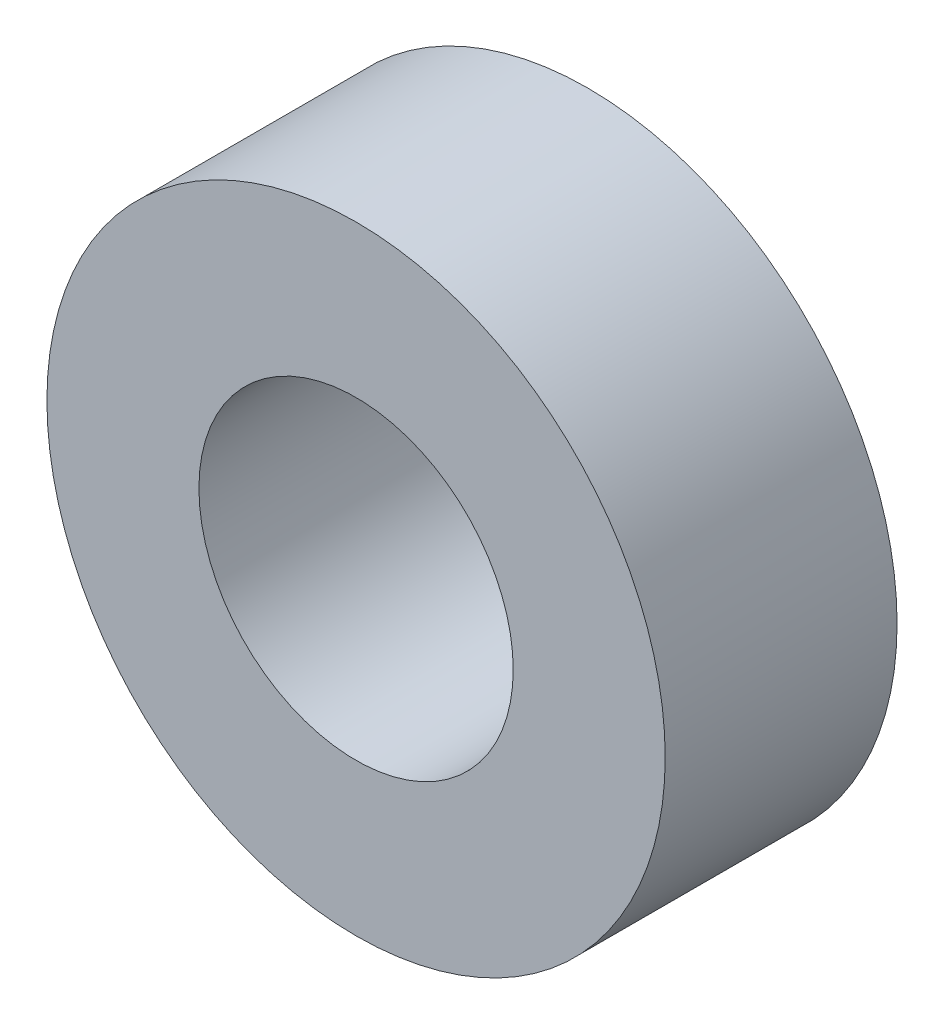
ISO-10303-21;
HEADER;
FILE_DESCRIPTION(('STEP AP214'),'2;1');
FILE_NAME('part.step','',(''),(''),'','','');
FILE_SCHEMA(('AUTOMOTIVE_DESIGN { 1 0 10303 214 1 1 1 1 }'));
ENDSEC;
DATA;
#1=APPLICATION_CONTEXT('core data for automotive mechanical design processes');
#2=APPLICATION_PROTOCOL_DEFINITION('international standard','automotive_design',2000,#1);
#3=PRODUCT_CONTEXT('',#1,'mechanical');
#4=PRODUCT('Part','Part','',(#3));
#5=PRODUCT_RELATED_PRODUCT_CATEGORY('part','',(#4));
#6=PRODUCT_DEFINITION_FORMATION('','',#4);
#7=PRODUCT_DEFINITION_CONTEXT('part definition',#1,'design');
#8=PRODUCT_DEFINITION('design','',#6,#7);
#9=PRODUCT_DEFINITION_SHAPE('','',#8);
#10=(LENGTH_UNIT() NAMED_UNIT(*) SI_UNIT(.MILLI.,.METRE.));
#11=(NAMED_UNIT(*) PLANE_ANGLE_UNIT() SI_UNIT($,.RADIAN.));
#12=(NAMED_UNIT(*) SI_UNIT($,.STERADIAN.) SOLID_ANGLE_UNIT());
#13=UNCERTAINTY_MEASURE_WITH_UNIT(LENGTH_MEASURE(1.E-05),#10,'distance_accuracy_value','');
#14=(GEOMETRIC_REPRESENTATION_CONTEXT(3) GLOBAL_UNCERTAINTY_ASSIGNED_CONTEXT((#13)) GLOBAL_UNIT_ASSIGNED_CONTEXT((#10,
#11,#12)) REPRESENTATION_CONTEXT('',''));
#15=CARTESIAN_POINT('',(0.,0.,0.));
#16=DIRECTION('',(0.,0.,1.));
#17=DIRECTION('',(1.,0.,0.));
#18=AXIS2_PLACEMENT_3D('',#15,#16,#17);
#19=CARTESIAN_POINT('',(0.,0.,-1.));
#20=DIRECTION('',(0.,0.,1.));
#21=DIRECTION('',(1.,0.,0.));
#22=AXIS2_PLACEMENT_3D('',#19,#20,#21);
#23=CYLINDRICAL_SURFACE('',#22,3.05);
#24=CARTESIAN_POINT('',(0.,0.,4.5));
#25=DIRECTION('',(0.,0.,1.));
#26=DIRECTION('',(1.,0.,0.));
#27=AXIS2_PLACEMENT_3D('',#24,#25,#26);
#28=CIRCLE('',#27,3.05);
#29=CARTESIAN_POINT('',(3.05,0.,4.5));
#30=VERTEX_POINT('',#29);
#31=EDGE_CURVE('E17',#30,#30,#28,.T.);
#32=ORIENTED_EDGE('',*,*,#31,.T.);
#33=EDGE_LOOP('',(#32));
#34=FACE_BOUND('',#33,.T.);
#35=CARTESIAN_POINT('',(0.,0.,0.));
#36=DIRECTION('',(0.,0.,1.));
#37=DIRECTION('',(1.,0.,0.));
#38=AXIS2_PLACEMENT_3D('',#35,#36,#37);
#39=CIRCLE('',#38,3.05);
#40=CARTESIAN_POINT('',(3.05,0.,0.));
#41=VERTEX_POINT('',#40);
#42=EDGE_CURVE('E9',#41,#41,#39,.T.);
#43=ORIENTED_EDGE('',*,*,#42,.F.);
#44=EDGE_LOOP('',(#43));
#45=FACE_BOUND('',#44,.T.);
#46=ADVANCED_FACE('F14',(#34,#45),#23,.F.);
#47=CARTESIAN_POINT('',(0.,0.,0.));
#48=DIRECTION('',(0.,0.,1.));
#49=DIRECTION('',(1.,0.,0.));
#50=AXIS2_PLACEMENT_3D('',#47,#48,#49);
#51=PLANE('',#50);
#52=ORIENTED_EDGE('',*,*,#42,.T.);
#53=EDGE_LOOP('',(#52));
#54=FACE_BOUND('',#53,.T.);
#55=CARTESIAN_POINT('',(0.,0.,0.));
#56=DIRECTION('',(0.,0.,1.));
#57=DIRECTION('',(1.,0.,0.));
#58=AXIS2_PLACEMENT_3D('',#55,#56,#57);
#59=CIRCLE('',#58,6.);
#60=CARTESIAN_POINT('',(6.,0.,0.));
#61=VERTEX_POINT('',#60);
#62=EDGE_CURVE('E31',#61,#61,#59,.T.);
#63=ORIENTED_EDGE('',*,*,#62,.F.);
#64=EDGE_LOOP('',(#63));
#65=FACE_BOUND('',#64,.T.);
#66=ADVANCED_FACE('F51',(#54,#65),#51,.F.);
#67=CARTESIAN_POINT('',(0.,0.,4.5));
#68=DIRECTION('',(0.,0.,1.));
#69=DIRECTION('',(1.,0.,0.));
#70=AXIS2_PLACEMENT_3D('',#67,#68,#69);
#71=PLANE('',#70);
#72=ORIENTED_EDGE('',*,*,#31,.F.);
#73=EDGE_LOOP('',(#72));
#74=FACE_BOUND('',#73,.T.);
#75=CARTESIAN_POINT('',(0.,0.,4.5));
#76=DIRECTION('',(0.,0.,1.));
#77=DIRECTION('',(1.,0.,0.));
#78=AXIS2_PLACEMENT_3D('',#75,#76,#77);
#79=CIRCLE('',#78,6.);
#80=CARTESIAN_POINT('',(6.,0.,4.5));
#81=VERTEX_POINT('',#80);
#82=EDGE_CURVE('E33',#81,#81,#79,.T.);
#83=ORIENTED_EDGE('',*,*,#82,.T.);
#84=EDGE_LOOP('',(#83));
#85=FACE_BOUND('',#84,.T.);
#86=ADVANCED_FACE('F42',(#74,#85),#71,.T.);
#87=CARTESIAN_POINT('',(0.,0.,0.));
#88=DIRECTION('',(0.,0.,1.));
#89=DIRECTION('',(1.,0.,0.));
#90=AXIS2_PLACEMENT_3D('',#87,#88,#89);
#91=CYLINDRICAL_SURFACE('',#90,6.);
#92=ORIENTED_EDGE('',*,*,#82,.F.);
#93=EDGE_LOOP('',(#92));
#94=FACE_BOUND('',#93,.T.);
#95=ORIENTED_EDGE('',*,*,#62,.T.);
#96=EDGE_LOOP('',(#95));
#97=FACE_BOUND('',#96,.T.);
#98=ADVANCED_FACE('F44',(#94,#97),#91,.T.);
#99=CLOSED_SHELL('',(#46,#66,#86,#98));
#100=MANIFOLD_SOLID_BREP('B1',#99);
#101=ADVANCED_BREP_SHAPE_REPRESENTATION('',(#18,#100),#14);
#102=SHAPE_DEFINITION_REPRESENTATION(#9,#101);
ENDSEC;
END-ISO-10303-21;
